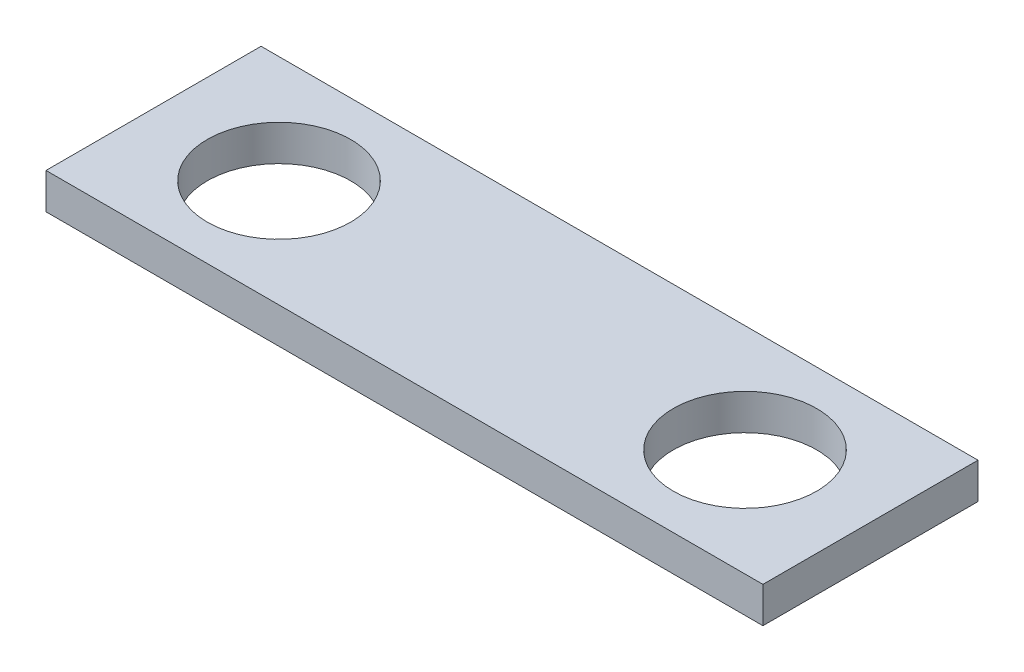
ISO-10303-21;
HEADER;
FILE_DESCRIPTION(('STEP AP214'),'2;1');
FILE_NAME('part.step','',(''),(''),'','','');
FILE_SCHEMA(('AUTOMOTIVE_DESIGN { 1 0 10303 214 1 1 1 1 }'));
ENDSEC;
DATA;
#1=APPLICATION_CONTEXT('core data for automotive mechanical design processes');
#2=APPLICATION_PROTOCOL_DEFINITION('international standard','automotive_design',2000,#1);
#3=PRODUCT_CONTEXT('',#1,'mechanical');
#4=PRODUCT('Part','Part','',(#3));
#5=PRODUCT_RELATED_PRODUCT_CATEGORY('part','',(#4));
#6=PRODUCT_DEFINITION_FORMATION('','',#4);
#7=PRODUCT_DEFINITION_CONTEXT('part definition',#1,'design');
#8=PRODUCT_DEFINITION('design','',#6,#7);
#9=PRODUCT_DEFINITION_SHAPE('','',#8);
#10=(LENGTH_UNIT() NAMED_UNIT(*) SI_UNIT(.MILLI.,.METRE.));
#11=(NAMED_UNIT(*) PLANE_ANGLE_UNIT() SI_UNIT($,.RADIAN.));
#12=(NAMED_UNIT(*) SI_UNIT($,.STERADIAN.) SOLID_ANGLE_UNIT());
#13=UNCERTAINTY_MEASURE_WITH_UNIT(LENGTH_MEASURE(1.E-05),#10,'distance_accuracy_value','');
#14=(GEOMETRIC_REPRESENTATION_CONTEXT(3) GLOBAL_UNCERTAINTY_ASSIGNED_CONTEXT((#13)) GLOBAL_UNIT_ASSIGNED_CONTEXT((#10,
#11,#12)) REPRESENTATION_CONTEXT('',''));
#15=CARTESIAN_POINT('',(0.,0.,0.));
#16=DIRECTION('',(0.,0.,1.));
#17=DIRECTION('',(1.,0.,0.));
#18=AXIS2_PLACEMENT_3D('',#15,#16,#17);
#19=CARTESIAN_POINT('',(0.,2.,0.));
#20=DIRECTION('',(0.,-1.,0.));
#21=DIRECTION('',(0.,0.,-1.));
#22=AXIS2_PLACEMENT_3D('',#19,#20,#21);
#23=PLANE('',#22);
#24=DIRECTION('',(0.,0.,1.));
#25=VECTOR('',#24,1.);
#26=CARTESIAN_POINT('',(0.,2.,0.));
#27=LINE('',#26,#25);
#28=CARTESIAN_POINT('',(0.,2.,-12.));
#29=VERTEX_POINT('',#28);
#30=CARTESIAN_POINT('',(0.,2.,0.));
#31=VERTEX_POINT('',#30);
#32=EDGE_CURVE('E92',#29,#31,#27,.T.);
#33=ORIENTED_EDGE('',*,*,#32,.T.);
#34=DIRECTION('',(1.,0.,0.));
#35=VECTOR('',#34,1.);
#36=CARTESIAN_POINT('',(0.,2.,0.));
#37=LINE('',#36,#35);
#38=CARTESIAN_POINT('',(40.,2.,0.));
#39=VERTEX_POINT('',#38);
#40=EDGE_CURVE('E87',#31,#39,#37,.T.);
#41=ORIENTED_EDGE('',*,*,#40,.T.);
#42=DIRECTION('',(0.,0.,-1.));
#43=VECTOR('',#42,1.);
#44=CARTESIAN_POINT('',(40.,2.,0.));
#45=LINE('',#44,#43);
#46=CARTESIAN_POINT('',(40.,2.,-12.));
#47=VERTEX_POINT('',#46);
#48=EDGE_CURVE('E90',#39,#47,#45,.T.);
#49=ORIENTED_EDGE('',*,*,#48,.T.);
#50=DIRECTION('',(-1.,0.,0.));
#51=VECTOR('',#50,1.);
#52=CARTESIAN_POINT('',(0.,2.,-12.));
#53=LINE('',#52,#51);
#54=EDGE_CURVE('E57',#47,#29,#53,.T.);
#55=ORIENTED_EDGE('',*,*,#54,.T.);
#56=EDGE_LOOP('',(#33,#41,#49,#55));
#57=FACE_BOUND('',#56,.T.);
#58=CARTESIAN_POINT('',(33.,2.,-6.));
#59=DIRECTION('',(0.,1.,0.));
#60=DIRECTION('',(0.,0.,1.));
#61=AXIS2_PLACEMENT_3D('',#58,#59,#60);
#62=CIRCLE('',#61,4.);
#63=CARTESIAN_POINT('',(33.,2.,-2.));
#64=VERTEX_POINT('',#63);
#65=EDGE_CURVE('E130',#64,#64,#62,.F.);
#66=ORIENTED_EDGE('',*,*,#65,.T.);
#67=EDGE_LOOP('',(#66));
#68=FACE_BOUND('',#67,.T.);
#69=CARTESIAN_POINT('',(7.,2.,-6.));
#70=DIRECTION('',(0.,1.,0.));
#71=DIRECTION('',(0.,0.,1.));
#72=AXIS2_PLACEMENT_3D('',#69,#70,#71);
#73=CIRCLE('',#72,4.);
#74=CARTESIAN_POINT('',(7.,2.,-2.));
#75=VERTEX_POINT('',#74);
#76=EDGE_CURVE('E138',#75,#75,#73,.T.);
#77=ORIENTED_EDGE('',*,*,#76,.F.);
#78=EDGE_LOOP('',(#77));
#79=FACE_BOUND('',#78,.T.);
#80=ADVANCED_FACE('F39',(#57,#68,#79),#23,.F.);
#81=CARTESIAN_POINT('',(0.,0.,0.));
#82=DIRECTION('',(0.,-1.,0.));
#83=DIRECTION('',(0.,0.,-1.));
#84=AXIS2_PLACEMENT_3D('',#81,#82,#83);
#85=PLANE('',#84);
#86=CARTESIAN_POINT('',(33.,0.,-6.));
#87=DIRECTION('',(0.,1.,0.));
#88=DIRECTION('',(0.,0.,1.));
#89=AXIS2_PLACEMENT_3D('',#86,#87,#88);
#90=CIRCLE('',#89,4.);
#91=CARTESIAN_POINT('',(33.,0.,-2.));
#92=VERTEX_POINT('',#91);
#93=EDGE_CURVE('E134',#92,#92,#90,.F.);
#94=ORIENTED_EDGE('',*,*,#93,.F.);
#95=EDGE_LOOP('',(#94));
#96=FACE_BOUND('',#95,.T.);
#97=DIRECTION('',(0.,0.,1.));
#98=VECTOR('',#97,1.);
#99=CARTESIAN_POINT('',(0.,0.,0.));
#100=LINE('',#99,#98);
#101=CARTESIAN_POINT('',(0.,0.,-12.));
#102=VERTEX_POINT('',#101);
#103=CARTESIAN_POINT('',(0.,0.,0.));
#104=VERTEX_POINT('',#103);
#105=EDGE_CURVE('E108',#102,#104,#100,.T.);
#106=ORIENTED_EDGE('',*,*,#105,.F.);
#107=DIRECTION('',(-1.,0.,0.));
#108=VECTOR('',#107,1.);
#109=CARTESIAN_POINT('',(0.,0.,-12.));
#110=LINE('',#109,#108);
#111=CARTESIAN_POINT('',(40.,0.,-12.));
#112=VERTEX_POINT('',#111);
#113=EDGE_CURVE('E80',#112,#102,#110,.T.);
#114=ORIENTED_EDGE('',*,*,#113,.F.);
#115=DIRECTION('',(0.,0.,-1.));
#116=VECTOR('',#115,1.);
#117=CARTESIAN_POINT('',(40.,0.,0.));
#118=LINE('',#117,#116);
#119=CARTESIAN_POINT('',(40.,0.,0.));
#120=VERTEX_POINT('',#119);
#121=EDGE_CURVE('E74',#120,#112,#118,.T.);
#122=ORIENTED_EDGE('',*,*,#121,.F.);
#123=DIRECTION('',(1.,0.,0.));
#124=VECTOR('',#123,1.);
#125=CARTESIAN_POINT('',(0.,0.,0.));
#126=LINE('',#125,#124);
#127=EDGE_CURVE('E97',#104,#120,#126,.T.);
#128=ORIENTED_EDGE('',*,*,#127,.F.);
#129=EDGE_LOOP('',(#106,#114,#122,#128));
#130=FACE_BOUND('',#129,.T.);
#131=CARTESIAN_POINT('',(7.,0.,-6.));
#132=DIRECTION('',(0.,1.,0.));
#133=DIRECTION('',(0.,0.,1.));
#134=AXIS2_PLACEMENT_3D('',#131,#132,#133);
#135=CIRCLE('',#134,4.);
#136=CARTESIAN_POINT('',(7.,0.,-2.));
#137=VERTEX_POINT('',#136);
#138=EDGE_CURVE('E112',#137,#137,#135,.T.);
#139=ORIENTED_EDGE('',*,*,#138,.T.);
#140=EDGE_LOOP('',(#139));
#141=FACE_BOUND('',#140,.T.);
#142=ADVANCED_FACE('F125',(#96,#130,#141),#85,.T.);
#143=CARTESIAN_POINT('',(0.,2.,0.));
#144=DIRECTION('',(1.,0.,0.));
#145=DIRECTION('',(0.,0.,-1.));
#146=AXIS2_PLACEMENT_3D('',#143,#144,#145);
#147=PLANE('',#146);
#148=ORIENTED_EDGE('',*,*,#105,.T.);
#149=DIRECTION('',(0.,-1.,0.));
#150=VECTOR('',#149,1.);
#151=CARTESIAN_POINT('',(0.,2.,0.));
#152=LINE('',#151,#150);
#153=EDGE_CURVE('E11',#31,#104,#152,.T.);
#154=ORIENTED_EDGE('',*,*,#153,.F.);
#155=ORIENTED_EDGE('',*,*,#32,.F.);
#156=DIRECTION('',(0.,-1.,0.));
#157=VECTOR('',#156,1.);
#158=CARTESIAN_POINT('',(0.,2.,-12.));
#159=LINE('',#158,#157);
#160=EDGE_CURVE('E104',#29,#102,#159,.T.);
#161=ORIENTED_EDGE('',*,*,#160,.T.);
#162=EDGE_LOOP('',(#148,#154,#155,#161));
#163=FACE_BOUND('',#162,.T.);
#164=ADVANCED_FACE('F41',(#163),#147,.F.);
#165=CARTESIAN_POINT('',(0.,2.,0.));
#166=DIRECTION('',(0.,0.,-1.));
#167=DIRECTION('',(-1.,0.,0.));
#168=AXIS2_PLACEMENT_3D('',#165,#166,#167);
#169=PLANE('',#168);
#170=ORIENTED_EDGE('',*,*,#127,.T.);
#171=DIRECTION('',(0.,-1.,0.));
#172=VECTOR('',#171,1.);
#173=CARTESIAN_POINT('',(40.,2.,0.));
#174=LINE('',#173,#172);
#175=EDGE_CURVE('E49',#39,#120,#174,.T.);
#176=ORIENTED_EDGE('',*,*,#175,.F.);
#177=ORIENTED_EDGE('',*,*,#40,.F.);
#178=ORIENTED_EDGE('',*,*,#153,.T.);
#179=EDGE_LOOP('',(#170,#176,#177,#178));
#180=FACE_BOUND('',#179,.T.);
#181=ADVANCED_FACE('F96',(#180),#169,.F.);
#182=CARTESIAN_POINT('',(40.,2.,0.));
#183=DIRECTION('',(-1.,0.,0.));
#184=DIRECTION('',(0.,0.,1.));
#185=AXIS2_PLACEMENT_3D('',#182,#183,#184);
#186=PLANE('',#185);
#187=ORIENTED_EDGE('',*,*,#121,.T.);
#188=DIRECTION('',(0.,-1.,0.));
#189=VECTOR('',#188,1.);
#190=CARTESIAN_POINT('',(40.,2.,-12.));
#191=LINE('',#190,#189);
#192=EDGE_CURVE('E99',#47,#112,#191,.T.);
#193=ORIENTED_EDGE('',*,*,#192,.F.);
#194=ORIENTED_EDGE('',*,*,#48,.F.);
#195=ORIENTED_EDGE('',*,*,#175,.T.);
#196=EDGE_LOOP('',(#187,#193,#194,#195));
#197=FACE_BOUND('',#196,.T.);
#198=ADVANCED_FACE('F100',(#197),#186,.F.);
#199=CARTESIAN_POINT('',(0.,2.,-12.));
#200=DIRECTION('',(0.,0.,1.));
#201=DIRECTION('',(1.,0.,0.));
#202=AXIS2_PLACEMENT_3D('',#199,#200,#201);
#203=PLANE('',#202);
#204=ORIENTED_EDGE('',*,*,#113,.T.);
#205=ORIENTED_EDGE('',*,*,#160,.F.);
#206=ORIENTED_EDGE('',*,*,#54,.F.);
#207=ORIENTED_EDGE('',*,*,#192,.T.);
#208=EDGE_LOOP('',(#204,#205,#206,#207));
#209=FACE_BOUND('',#208,.T.);
#210=ADVANCED_FACE('F122',(#209),#203,.F.);
#211=CARTESIAN_POINT('',(33.,0.,-6.));
#212=DIRECTION('',(0.,1.,0.));
#213=DIRECTION('',(0.,0.,1.));
#214=AXIS2_PLACEMENT_3D('',#211,#212,#213);
#215=CYLINDRICAL_SURFACE('',#214,4.);
#216=ORIENTED_EDGE('',*,*,#93,.T.);
#217=EDGE_LOOP('',(#216));
#218=FACE_BOUND('',#217,.T.);
#219=ORIENTED_EDGE('',*,*,#65,.F.);
#220=EDGE_LOOP('',(#219));
#221=FACE_BOUND('',#220,.T.);
#222=ADVANCED_FACE('F149',(#218,#221),#215,.F.);
#223=CARTESIAN_POINT('',(7.,0.,-6.));
#224=DIRECTION('',(0.,1.,0.));
#225=DIRECTION('',(0.,0.,1.));
#226=AXIS2_PLACEMENT_3D('',#223,#224,#225);
#227=CYLINDRICAL_SURFACE('',#226,4.);
#228=ORIENTED_EDGE('',*,*,#138,.F.);
#229=EDGE_LOOP('',(#228));
#230=FACE_BOUND('',#229,.T.);
#231=ORIENTED_EDGE('',*,*,#76,.T.);
#232=EDGE_LOOP('',(#231));
#233=FACE_BOUND('',#232,.T.);
#234=ADVANCED_FACE('F146',(#230,#233),#227,.F.);
#235=CLOSED_SHELL('',(#80,#142,#164,#181,#198,#210,#222,#234));
#236=MANIFOLD_SOLID_BREP('B2',#235);
#237=ADVANCED_BREP_SHAPE_REPRESENTATION('',(#18,#236),#14);
#238=SHAPE_DEFINITION_REPRESENTATION(#9,#237);
ENDSEC;
END-ISO-10303-21;
